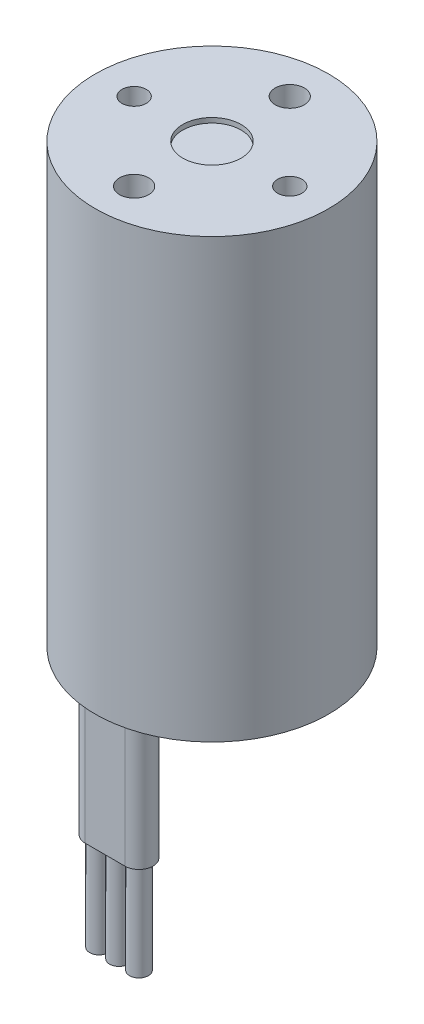
ISO-10303-21;
HEADER;
FILE_DESCRIPTION(('STEP AP214'),'2;1');
FILE_NAME('part.step','',(''),(''),'','','');
FILE_SCHEMA(('AUTOMOTIVE_DESIGN { 1 0 10303 214 1 1 1 1 }'));
ENDSEC;
DATA;
#1=APPLICATION_CONTEXT('core data for automotive mechanical design processes');
#2=APPLICATION_PROTOCOL_DEFINITION('international standard','automotive_design',2000,#1);
#3=PRODUCT_CONTEXT('',#1,'mechanical');
#4=PRODUCT('Part','Part','',(#3));
#5=PRODUCT_RELATED_PRODUCT_CATEGORY('part','',(#4));
#6=PRODUCT_DEFINITION_FORMATION('','',#4);
#7=PRODUCT_DEFINITION_CONTEXT('part definition',#1,'design');
#8=PRODUCT_DEFINITION('design','',#6,#7);
#9=PRODUCT_DEFINITION_SHAPE('','',#8);
#10=(LENGTH_UNIT() NAMED_UNIT(*) SI_UNIT(.MILLI.,.METRE.));
#11=(NAMED_UNIT(*) PLANE_ANGLE_UNIT() SI_UNIT($,.RADIAN.));
#12=(NAMED_UNIT(*) SI_UNIT($,.STERADIAN.) SOLID_ANGLE_UNIT());
#13=UNCERTAINTY_MEASURE_WITH_UNIT(LENGTH_MEASURE(1.E-05),#10,'distance_accuracy_value','');
#14=(GEOMETRIC_REPRESENTATION_CONTEXT(3) GLOBAL_UNCERTAINTY_ASSIGNED_CONTEXT((#13)) GLOBAL_UNIT_ASSIGNED_CONTEXT((#10,
#11,#12)) REPRESENTATION_CONTEXT('',''));
#15=CARTESIAN_POINT('',(0.,0.,0.));
#16=DIRECTION('',(0.,0.,1.));
#17=DIRECTION('',(1.,0.,0.));
#18=AXIS2_PLACEMENT_3D('',#15,#16,#17);
#19=CARTESIAN_POINT('',(-2.05357993225099,-13.,9.55357993225099));
#20=DIRECTION('',(0.,-1.,0.));
#21=DIRECTION('',(0.,0.,-1.));
#22=AXIS2_PLACEMENT_3D('',#19,#20,#21);
#23=PLANE('',#22);
#24=CARTESIAN_POINT('',(0.,-13.,9.55357993225099));
#25=DIRECTION('',(0.,-1.,0.));
#26=DIRECTION('',(0.,0.,-1.));
#27=AXIS2_PLACEMENT_3D('',#24,#25,#26);
#28=CIRCLE('',#27,0.966568061867365);
#29=CARTESIAN_POINT('',(0.,-13.,8.58701187038363));
#30=VERTEX_POINT('',#29);
#31=EDGE_CURVE('E167',#30,#30,#28,.T.);
#32=ORIENTED_EDGE('',*,*,#31,.F.);
#33=EDGE_LOOP('',(#32));
#34=FACE_BOUND('',#33,.T.);
#35=CARTESIAN_POINT('',(-2.05357993225099,-13.,9.55357993225099));
#36=DIRECTION('',(0.,-1.,0.));
#37=DIRECTION('',(0.,0.,-1.));
#38=AXIS2_PLACEMENT_3D('',#35,#36,#37);
#39=CIRCLE('',#38,1.44642006774901);
#40=CARTESIAN_POINT('',(-2.05357993225099,-13.,11.));
#41=VERTEX_POINT('',#40);
#42=CARTESIAN_POINT('',(-2.05357993225099,-13.,8.10715986450198));
#43=VERTEX_POINT('',#42);
#44=EDGE_CURVE('E96',#41,#43,#39,.T.);
#45=ORIENTED_EDGE('',*,*,#44,.T.);
#46=DIRECTION('',(1.,0.,0.));
#47=VECTOR('',#46,1.);
#48=CARTESIAN_POINT('',(-2.05357993225099,-13.,8.10715986450198));
#49=LINE('',#48,#47);
#50=CARTESIAN_POINT('',(2.05357993225099,-13.,8.10715986450198));
#51=VERTEX_POINT('',#50);
#52=EDGE_CURVE('E85',#43,#51,#49,.T.);
#53=ORIENTED_EDGE('',*,*,#52,.T.);
#54=CARTESIAN_POINT('',(2.05357993225099,-13.,9.55357993225099));
#55=DIRECTION('',(0.,-1.,0.));
#56=DIRECTION('',(0.,0.,-1.));
#57=AXIS2_PLACEMENT_3D('',#54,#55,#56);
#58=CIRCLE('',#57,1.44642006774901);
#59=CARTESIAN_POINT('',(2.05357993225099,-13.,11.));
#60=VERTEX_POINT('',#59);
#61=EDGE_CURVE('E95',#51,#60,#58,.T.);
#62=ORIENTED_EDGE('',*,*,#61,.T.);
#63=DIRECTION('',(-1.,0.,0.));
#64=VECTOR('',#63,1.);
#65=CARTESIAN_POINT('',(-2.05357993225099,-13.,11.));
#66=LINE('',#65,#64);
#67=EDGE_CURVE('E101',#60,#41,#66,.T.);
#68=ORIENTED_EDGE('',*,*,#67,.T.);
#69=EDGE_LOOP('',(#45,#53,#62,#68));
#70=FACE_BOUND('',#69,.T.);
#71=CARTESIAN_POINT('',(-2.05357993225099,-13.,9.55357993225099));
#72=DIRECTION('',(0.,-1.,0.));
#73=DIRECTION('',(0.,0.,-1.));
#74=AXIS2_PLACEMENT_3D('',#71,#72,#73);
#75=CIRCLE('',#74,0.966568061867365);
#76=CARTESIAN_POINT('',(-2.05357993225099,-13.,8.58701187038363));
#77=VERTEX_POINT('',#76);
#78=EDGE_CURVE('E161',#77,#77,#75,.T.);
#79=ORIENTED_EDGE('',*,*,#78,.F.);
#80=EDGE_LOOP('',(#79));
#81=FACE_BOUND('',#80,.T.);
#82=CARTESIAN_POINT('',(2.05357993225099,-13.,9.55357993225099));
#83=DIRECTION('',(0.,-1.,0.));
#84=DIRECTION('',(0.,0.,-1.));
#85=AXIS2_PLACEMENT_3D('',#82,#83,#84);
#86=CIRCLE('',#85,0.966568061867365);
#87=CARTESIAN_POINT('',(2.05357993225099,-13.,8.58701187038363));
#88=VERTEX_POINT('',#87);
#89=EDGE_CURVE('E173',#88,#88,#86,.T.);
#90=ORIENTED_EDGE('',*,*,#89,.F.);
#91=EDGE_LOOP('',(#90));
#92=FACE_BOUND('',#91,.T.);
#93=ADVANCED_FACE('F35',(#34,#70,#81,#92),#23,.T.);
#94=CARTESIAN_POINT('',(0.,0.,0.));
#95=DIRECTION('',(0.,1.,0.));
#96=DIRECTION('',(0.,0.,1.));
#97=AXIS2_PLACEMENT_3D('',#94,#95,#96);
#98=PLANE('',#97);
#99=CARTESIAN_POINT('',(0.,0.,0.));
#100=DIRECTION('',(0.,-1.,0.));
#101=DIRECTION('',(0.,0.,-1.));
#102=AXIS2_PLACEMENT_3D('',#99,#100,#101);
#103=CIRCLE('',#102,3.);
#104=CARTESIAN_POINT('',(0.,0.,-3.));
#105=VERTEX_POINT('',#104);
#106=EDGE_CURVE('E179',#105,#105,#103,.T.);
#107=ORIENTED_EDGE('',*,*,#106,.F.);
#108=EDGE_LOOP('',(#107));
#109=FACE_BOUND('',#108,.T.);
#110=CARTESIAN_POINT('',(0.,0.,0.));
#111=DIRECTION('',(0.,1.,0.));
#112=DIRECTION('',(0.,0.,1.));
#113=AXIS2_PLACEMENT_3D('',#110,#111,#112);
#114=CIRCLE('',#113,12.);
#115=CARTESIAN_POINT('',(0.,0.,-12.));
#116=VERTEX_POINT('',#115);
#117=EDGE_CURVE('E39',#116,#116,#114,.T.);
#118=ORIENTED_EDGE('',*,*,#117,.F.);
#119=EDGE_LOOP('',(#118));
#120=FACE_BOUND('',#119,.T.);
#121=CARTESIAN_POINT('',(-2.05357993225099,0.,9.55357993225099));
#122=DIRECTION('',(0.,-1.,0.));
#123=DIRECTION('',(0.,0.,-1.));
#124=AXIS2_PLACEMENT_3D('',#121,#122,#123);
#125=CIRCLE('',#124,1.44642006774901);
#126=CARTESIAN_POINT('',(-2.05357993225099,0.,11.));
#127=VERTEX_POINT('',#126);
#128=CARTESIAN_POINT('',(-2.05357993225099,0.,8.10715986450198));
#129=VERTEX_POINT('',#128);
#130=EDGE_CURVE('E108',#127,#129,#125,.T.);
#131=ORIENTED_EDGE('',*,*,#130,.F.);
#132=DIRECTION('',(-1.,0.,0.));
#133=VECTOR('',#132,1.);
#134=CARTESIAN_POINT('',(-2.05357993225099,0.,11.));
#135=LINE('',#134,#133);
#136=CARTESIAN_POINT('',(2.05357993225099,0.,11.));
#137=VERTEX_POINT('',#136);
#138=EDGE_CURVE('E105',#137,#127,#135,.T.);
#139=ORIENTED_EDGE('',*,*,#138,.F.);
#140=CARTESIAN_POINT('',(2.05357993225099,0.,9.55357993225099));
#141=DIRECTION('',(0.,-1.,0.));
#142=DIRECTION('',(0.,0.,-1.));
#143=AXIS2_PLACEMENT_3D('',#140,#141,#142);
#144=CIRCLE('',#143,1.44642006774901);
#145=CARTESIAN_POINT('',(2.05357993225099,0.,8.10715986450198));
#146=VERTEX_POINT('',#145);
#147=EDGE_CURVE('E55',#146,#137,#144,.T.);
#148=ORIENTED_EDGE('',*,*,#147,.F.);
#149=DIRECTION('',(1.,0.,0.));
#150=VECTOR('',#149,1.);
#151=CARTESIAN_POINT('',(-2.05357993225099,0.,8.10715986450198));
#152=LINE('',#151,#150);
#153=EDGE_CURVE('E50',#129,#146,#152,.T.);
#154=ORIENTED_EDGE('',*,*,#153,.F.);
#155=EDGE_LOOP('',(#131,#139,#148,#154));
#156=FACE_BOUND('',#155,.T.);
#157=ADVANCED_FACE('F143',(#109,#120,#156),#98,.F.);
#158=CARTESIAN_POINT('',(0.,45.,0.));
#159=DIRECTION('',(0.,-1.,0.));
#160=DIRECTION('',(0.,0.,-1.));
#161=AXIS2_PLACEMENT_3D('',#158,#159,#160);
#162=CYLINDRICAL_SURFACE('',#161,12.);
#163=CARTESIAN_POINT('',(0.,45.,0.));
#164=DIRECTION('',(0.,1.,0.));
#165=DIRECTION('',(0.,0.,1.));
#166=AXIS2_PLACEMENT_3D('',#163,#164,#165);
#167=CIRCLE('',#166,12.);
#168=CARTESIAN_POINT('',(0.,45.,-12.));
#169=VERTEX_POINT('',#168);
#170=EDGE_CURVE('E11',#169,#169,#167,.T.);
#171=CARTESIAN_POINT('',(0.,45.,-12.));
#172=CARTESIAN_POINT('',(0.,44.53125,-12.));
#173=CARTESIAN_POINT('',(0.,44.0625,-12.));
#174=CARTESIAN_POINT('',(0.,43.125,-12.));
#175=CARTESIAN_POINT('',(0.,42.65625,-12.));
#176=CARTESIAN_POINT('',(0.,41.71875,-12.));
#177=CARTESIAN_POINT('',(0.,41.25,-12.));
#178=CARTESIAN_POINT('',(0.,40.3125,-12.));
#179=CARTESIAN_POINT('',(0.,39.84375,-12.));
#180=CARTESIAN_POINT('',(0.,38.90625,-12.));
#181=CARTESIAN_POINT('',(0.,38.4375,-12.));
#182=CARTESIAN_POINT('',(0.,37.5,-12.));
#183=CARTESIAN_POINT('',(0.,37.03125,-12.));
#184=CARTESIAN_POINT('',(0.,36.09375,-12.));
#185=CARTESIAN_POINT('',(0.,35.625,-12.));
#186=CARTESIAN_POINT('',(0.,34.6875,-12.));
#187=CARTESIAN_POINT('',(0.,34.21875,-12.));
#188=CARTESIAN_POINT('',(0.,33.28125,-12.));
#189=CARTESIAN_POINT('',(0.,32.8125,-12.));
#190=CARTESIAN_POINT('',(0.,31.875,-12.));
#191=CARTESIAN_POINT('',(0.,31.40625,-12.));
#192=CARTESIAN_POINT('',(0.,30.46875,-12.));
#193=CARTESIAN_POINT('',(0.,30.,-12.));
#194=CARTESIAN_POINT('',(0.,29.0625,-12.));
#195=CARTESIAN_POINT('',(0.,28.59375,-12.));
#196=CARTESIAN_POINT('',(0.,27.65625,-12.));
#197=CARTESIAN_POINT('',(0.,27.1875,-12.));
#198=CARTESIAN_POINT('',(0.,26.25,-12.));
#199=CARTESIAN_POINT('',(0.,25.78125,-12.));
#200=CARTESIAN_POINT('',(0.,24.84375,-12.));
#201=CARTESIAN_POINT('',(0.,24.375,-12.));
#202=CARTESIAN_POINT('',(0.,23.4375,-12.));
#203=CARTESIAN_POINT('',(0.,22.96875,-12.));
#204=CARTESIAN_POINT('',(0.,22.03125,-12.));
#205=CARTESIAN_POINT('',(0.,21.5625,-12.));
#206=CARTESIAN_POINT('',(0.,20.625,-12.));
#207=CARTESIAN_POINT('',(0.,20.15625,-12.));
#208=CARTESIAN_POINT('',(0.,19.21875,-12.));
#209=CARTESIAN_POINT('',(0.,18.75,-12.));
#210=CARTESIAN_POINT('',(0.,17.8125,-12.));
#211=CARTESIAN_POINT('',(0.,17.34375,-12.));
#212=CARTESIAN_POINT('',(0.,16.40625,-12.));
#213=CARTESIAN_POINT('',(0.,15.9375,-12.));
#214=CARTESIAN_POINT('',(0.,15.,-12.));
#215=CARTESIAN_POINT('',(0.,14.53125,-12.));
#216=CARTESIAN_POINT('',(0.,13.59375,-12.));
#217=CARTESIAN_POINT('',(0.,13.125,-12.));
#218=CARTESIAN_POINT('',(0.,12.1875,-12.));
#219=CARTESIAN_POINT('',(0.,11.71875,-12.));
#220=CARTESIAN_POINT('',(0.,10.78125,-12.));
#221=CARTESIAN_POINT('',(0.,10.3125,-12.));
#222=CARTESIAN_POINT('',(0.,9.37499999999999,-12.));
#223=CARTESIAN_POINT('',(0.,8.90624999999999,-12.));
#224=CARTESIAN_POINT('',(0.,7.96874999999999,-12.));
#225=CARTESIAN_POINT('',(0.,7.5,-12.));
#226=CARTESIAN_POINT('',(0.,6.56249999999999,-12.));
#227=CARTESIAN_POINT('',(0.,6.09374999999999,-12.));
#228=CARTESIAN_POINT('',(0.,5.15624999999999,-12.));
#229=CARTESIAN_POINT('',(0.,4.68749999999999,-12.));
#230=CARTESIAN_POINT('',(0.,3.74999999999999,-12.));
#231=CARTESIAN_POINT('',(0.,3.28124999999999,-12.));
#232=CARTESIAN_POINT('',(0.,2.34374999999999,-12.));
#233=CARTESIAN_POINT('',(0.,1.87499999999999,-12.));
#234=CARTESIAN_POINT('',(0.,0.937499999999992,-12.));
#235=CARTESIAN_POINT('',(0.,0.468749999999993,-12.));
#236=CARTESIAN_POINT('',(0.,0.,-12.));
#237=B_SPLINE_CURVE_WITH_KNOTS('',3,(#171,#172,#173,#174,#175,#176,#177,#178,#179,#180,#181,
#182,#183,#184,#185,#186,#187,#188,#189,#190,#191,#192,#193,#194,#195,#196,#197,#198,#199,#200,
#201,#202,#203,#204,#205,#206,#207,#208,#209,#210,#211,#212,#213,#214,#215,#216,#217,#218,#219,
#220,#221,#222,#223,#224,#225,#226,#227,#228,#229,#230,#231,#232,#233,#234,#235,#236),
.UNSPECIFIED.,.F.,.F.,(4,2,2,2,2,2,2,2,2,2,2,2,2,2,2,2,2,2,2,2,2,2,2,2,2,2,2,2,2,2,2,2,4),(0.,
1.40625,2.8125,4.21874999999999,5.625,7.03125,8.43749999999999,9.84375,11.25,12.65625,14.0625,
15.46875,16.875,18.28125,19.6875,21.09375,22.5,23.90625,25.3125,26.71875,28.125,29.53125,
30.9375,32.34375,33.75,35.15625,36.5625,37.96875,39.375,40.78125,42.1875,43.59375,45.),.UNSPECIFIED.);
#238=EDGE_CURVE('BSEAM37',#169,#116,#237,.T.);
#239=ORIENTED_EDGE('',*,*,#170,.F.);
#240=ORIENTED_EDGE('',*,*,#117,.T.);
#241=ORIENTED_EDGE('',*,*,#238,.T.);
#242=ORIENTED_EDGE('',*,*,#238,.F.);
#243=EDGE_LOOP('',(#239,#241,#240,#242));
#244=FACE_BOUND('',#243,.T.);
#245=ADVANCED_FACE('F37',(#244),#162,.T.);
#246=CARTESIAN_POINT('',(0.,45.,0.));
#247=DIRECTION('',(0.,1.,0.));
#248=DIRECTION('',(0.,0.,1.));
#249=AXIS2_PLACEMENT_3D('',#246,#247,#248);
#250=PLANE('',#249);
#251=CARTESIAN_POINT('',(0.,45.,0.));
#252=DIRECTION('',(0.,1.,0.));
#253=DIRECTION('',(0.,0.,1.));
#254=AXIS2_PLACEMENT_3D('',#251,#252,#253);
#255=CIRCLE('',#254,3.);
#256=CARTESIAN_POINT('',(0.,45.,3.));
#257=VERTEX_POINT('',#256);
#258=EDGE_CURVE('E185',#257,#257,#255,.T.);
#259=ORIENTED_EDGE('',*,*,#258,.F.);
#260=EDGE_LOOP('',(#259));
#261=FACE_BOUND('',#260,.T.);
#262=CARTESIAN_POINT('',(0.,45.,-8.));
#263=DIRECTION('',(0.,1.,0.));
#264=DIRECTION('',(0.,0.,1.));
#265=AXIS2_PLACEMENT_3D('',#262,#263,#264);
#266=CIRCLE('',#265,1.5);
#267=CARTESIAN_POINT('',(0.,45.,-6.5));
#268=VERTEX_POINT('',#267);
#269=EDGE_CURVE('E109',#268,#268,#266,.T.);
#270=ORIENTED_EDGE('',*,*,#269,.F.);
#271=EDGE_LOOP('',(#270));
#272=FACE_BOUND('',#271,.T.);
#273=CARTESIAN_POINT('',(0.,45.,8.));
#274=DIRECTION('',(0.,1.,0.));
#275=DIRECTION('',(0.,0.,1.));
#276=AXIS2_PLACEMENT_3D('',#273,#274,#275);
#277=CIRCLE('',#276,1.5);
#278=CARTESIAN_POINT('',(0.,45.,9.5));
#279=VERTEX_POINT('',#278);
#280=EDGE_CURVE('E120',#279,#279,#277,.T.);
#281=ORIENTED_EDGE('',*,*,#280,.F.);
#282=EDGE_LOOP('',(#281));
#283=FACE_BOUND('',#282,.T.);
#284=CARTESIAN_POINT('',(8.,45.,0.));
#285=DIRECTION('',(0.,1.,0.));
#286=DIRECTION('',(0.,0.,1.));
#287=AXIS2_PLACEMENT_3D('',#284,#285,#286);
#288=CIRCLE('',#287,1.24999999999999);
#289=CARTESIAN_POINT('',(8.,45.,1.25000000000004));
#290=VERTEX_POINT('',#289);
#291=EDGE_CURVE('E126',#290,#290,#288,.T.);
#292=ORIENTED_EDGE('',*,*,#291,.F.);
#293=EDGE_LOOP('',(#292));
#294=FACE_BOUND('',#293,.T.);
#295=CARTESIAN_POINT('',(-8.,45.,0.));
#296=DIRECTION('',(0.,1.,0.));
#297=DIRECTION('',(0.,0.,1.));
#298=AXIS2_PLACEMENT_3D('',#295,#296,#297);
#299=CIRCLE('',#298,1.24999999999999);
#300=CARTESIAN_POINT('',(-8.,45.,1.24999999999999));
#301=VERTEX_POINT('',#300);
#302=EDGE_CURVE('E132',#301,#301,#299,.T.);
#303=ORIENTED_EDGE('',*,*,#302,.F.);
#304=EDGE_LOOP('',(#303));
#305=FACE_BOUND('',#304,.T.);
#306=ORIENTED_EDGE('',*,*,#170,.T.);
#307=EDGE_LOOP('',(#306));
#308=FACE_BOUND('',#307,.T.);
#309=ADVANCED_FACE('F200',(#261,#272,#283,#294,#305,#308),#250,.T.);
#310=CARTESIAN_POINT('',(-8.,41.,0.));
#311=DIRECTION('',(0.,1.,0.));
#312=DIRECTION('',(0.,0.,1.));
#313=AXIS2_PLACEMENT_3D('',#310,#311,#312);
#314=CONICAL_SURFACE('',#313,1.25,1.02974425867666);
#315=CARTESIAN_POINT('',(-8.,40.2489242262155,0.));
#316=VERTEX_POINT('',#315);
#317=VERTEX_LOOP('',#316);
#318=FACE_BOUND('',#317,.T.);
#319=CARTESIAN_POINT('',(-8.,41.,0.));
#320=DIRECTION('',(0.,1.,0.));
#321=DIRECTION('',(0.,0.,1.));
#322=AXIS2_PLACEMENT_3D('',#319,#320,#321);
#323=CIRCLE('',#322,1.25);
#324=CARTESIAN_POINT('',(-8.,41.,1.25));
#325=VERTEX_POINT('',#324);
#326=EDGE_CURVE('E135',#325,#325,#323,.T.);
#327=ORIENTED_EDGE('',*,*,#326,.T.);
#328=EDGE_LOOP('',(#327));
#329=FACE_BOUND('',#328,.T.);
#330=ADVANCED_FACE('F203',(#318,#329),#314,.F.);
#331=CARTESIAN_POINT('',(-8.,45.,0.));
#332=DIRECTION('',(0.,1.,0.));
#333=DIRECTION('',(0.,0.,1.));
#334=AXIS2_PLACEMENT_3D('',#331,#332,#333);
#335=CYLINDRICAL_SURFACE('',#334,1.24999999999999);
#336=ORIENTED_EDGE('',*,*,#326,.F.);
#337=EDGE_LOOP('',(#336));
#338=FACE_BOUND('',#337,.T.);
#339=ORIENTED_EDGE('',*,*,#302,.T.);
#340=EDGE_LOOP('',(#339));
#341=FACE_BOUND('',#340,.T.);
#342=ADVANCED_FACE('F261',(#338,#341),#335,.F.);
#343=CARTESIAN_POINT('',(8.,41.,0.));
#344=DIRECTION('',(0.,1.,0.));
#345=DIRECTION('',(0.,0.,1.));
#346=AXIS2_PLACEMENT_3D('',#343,#344,#345);
#347=CONICAL_SURFACE('',#346,1.25,1.02974425867666);
#348=CARTESIAN_POINT('',(8.,40.2489242262155,0.));
#349=VERTEX_POINT('',#348);
#350=VERTEX_LOOP('',#349);
#351=FACE_BOUND('',#350,.T.);
#352=CARTESIAN_POINT('',(8.,41.,0.));
#353=DIRECTION('',(0.,1.,0.));
#354=DIRECTION('',(0.,0.,1.));
#355=AXIS2_PLACEMENT_3D('',#352,#353,#354);
#356=CIRCLE('',#355,1.25);
#357=CARTESIAN_POINT('',(8.,41.,1.25000000000005));
#358=VERTEX_POINT('',#357);
#359=EDGE_CURVE('E129',#358,#358,#356,.T.);
#360=ORIENTED_EDGE('',*,*,#359,.T.);
#361=EDGE_LOOP('',(#360));
#362=FACE_BOUND('',#361,.T.);
#363=ADVANCED_FACE('F257',(#351,#362),#347,.F.);
#364=CARTESIAN_POINT('',(8.,45.,0.));
#365=DIRECTION('',(0.,1.,0.));
#366=DIRECTION('',(0.,0.,1.));
#367=AXIS2_PLACEMENT_3D('',#364,#365,#366);
#368=CYLINDRICAL_SURFACE('',#367,1.24999999999999);
#369=ORIENTED_EDGE('',*,*,#359,.F.);
#370=EDGE_LOOP('',(#369));
#371=FACE_BOUND('',#370,.T.);
#372=ORIENTED_EDGE('',*,*,#291,.T.);
#373=EDGE_LOOP('',(#372));
#374=FACE_BOUND('',#373,.T.);
#375=ADVANCED_FACE('F253',(#371,#374),#368,.F.);
#376=CARTESIAN_POINT('',(0.,41.,8.));
#377=DIRECTION('',(0.,1.,0.));
#378=DIRECTION('',(0.,0.,1.));
#379=AXIS2_PLACEMENT_3D('',#376,#377,#378);
#380=CONICAL_SURFACE('',#379,1.5,1.02974425867665);
#381=CARTESIAN_POINT('',(0.,40.0987090714587,8.));
#382=VERTEX_POINT('',#381);
#383=VERTEX_LOOP('',#382);
#384=FACE_BOUND('',#383,.T.);
#385=CARTESIAN_POINT('',(0.,41.,8.));
#386=DIRECTION('',(0.,1.,0.));
#387=DIRECTION('',(0.,0.,1.));
#388=AXIS2_PLACEMENT_3D('',#385,#386,#387);
#389=CIRCLE('',#388,1.5);
#390=CARTESIAN_POINT('',(0.,41.,9.5));
#391=VERTEX_POINT('',#390);
#392=EDGE_CURVE('E123',#391,#391,#389,.T.);
#393=ORIENTED_EDGE('',*,*,#392,.T.);
#394=EDGE_LOOP('',(#393));
#395=FACE_BOUND('',#394,.T.);
#396=ADVANCED_FACE('F249',(#384,#395),#380,.F.);
#397=CARTESIAN_POINT('',(0.,45.,8.));
#398=DIRECTION('',(0.,1.,0.));
#399=DIRECTION('',(0.,0.,1.));
#400=AXIS2_PLACEMENT_3D('',#397,#398,#399);
#401=CYLINDRICAL_SURFACE('',#400,1.5);
#402=ORIENTED_EDGE('',*,*,#392,.F.);
#403=EDGE_LOOP('',(#402));
#404=FACE_BOUND('',#403,.T.);
#405=ORIENTED_EDGE('',*,*,#280,.T.);
#406=EDGE_LOOP('',(#405));
#407=FACE_BOUND('',#406,.T.);
#408=ADVANCED_FACE('F245',(#404,#407),#401,.F.);
#409=CARTESIAN_POINT('',(0.,41.,-8.));
#410=DIRECTION('',(0.,1.,0.));
#411=DIRECTION('',(0.,0.,1.));
#412=AXIS2_PLACEMENT_3D('',#409,#410,#411);
#413=CONICAL_SURFACE('',#412,1.5,1.02974425867665);
#414=CARTESIAN_POINT('',(0.,40.0987090714587,-8.));
#415=VERTEX_POINT('',#414);
#416=VERTEX_LOOP('',#415);
#417=FACE_BOUND('',#416,.T.);
#418=CARTESIAN_POINT('',(0.,41.,-8.));
#419=DIRECTION('',(0.,1.,0.));
#420=DIRECTION('',(0.,0.,1.));
#421=AXIS2_PLACEMENT_3D('',#418,#419,#420);
#422=CIRCLE('',#421,1.5);
#423=CARTESIAN_POINT('',(0.,41.,-6.5));
#424=VERTEX_POINT('',#423);
#425=EDGE_CURVE('E112',#424,#424,#422,.T.);
#426=ORIENTED_EDGE('',*,*,#425,.T.);
#427=EDGE_LOOP('',(#426));
#428=FACE_BOUND('',#427,.T.);
#429=ADVANCED_FACE('F241',(#417,#428),#413,.F.);
#430=CARTESIAN_POINT('',(0.,45.,-8.));
#431=DIRECTION('',(0.,1.,0.));
#432=DIRECTION('',(0.,0.,1.));
#433=AXIS2_PLACEMENT_3D('',#430,#431,#432);
#434=CYLINDRICAL_SURFACE('',#433,1.5);
#435=ORIENTED_EDGE('',*,*,#425,.F.);
#436=EDGE_LOOP('',(#435));
#437=FACE_BOUND('',#436,.T.);
#438=ORIENTED_EDGE('',*,*,#269,.T.);
#439=EDGE_LOOP('',(#438));
#440=FACE_BOUND('',#439,.T.);
#441=ADVANCED_FACE('F238',(#437,#440),#434,.F.);
#442=CARTESIAN_POINT('',(-2.05357993225099,-13.,9.55357993225099));
#443=DIRECTION('',(0.,1.,0.));
#444=DIRECTION('',(0.,0.,1.));
#445=AXIS2_PLACEMENT_3D('',#442,#443,#444);
#446=CYLINDRICAL_SURFACE('',#445,1.44642006774901);
#447=ORIENTED_EDGE('',*,*,#130,.T.);
#448=DIRECTION('',(0.,1.,0.));
#449=VECTOR('',#448,1.);
#450=CARTESIAN_POINT('',(-2.05357993225099,-13.,8.10715986450198));
#451=LINE('',#450,#449);
#452=EDGE_CURVE('E89',#43,#129,#451,.T.);
#453=ORIENTED_EDGE('',*,*,#452,.F.);
#454=ORIENTED_EDGE('',*,*,#44,.F.);
#455=DIRECTION('',(0.,1.,0.));
#456=VECTOR('',#455,1.);
#457=CARTESIAN_POINT('',(-2.05357993225099,-13.,11.));
#458=LINE('',#457,#456);
#459=EDGE_CURVE('E152',#41,#127,#458,.T.);
#460=ORIENTED_EDGE('',*,*,#459,.T.);
#461=EDGE_LOOP('',(#447,#453,#454,#460));
#462=FACE_BOUND('',#461,.T.);
#463=ADVANCED_FACE('F107',(#462),#446,.T.);
#464=CARTESIAN_POINT('',(-2.05357993225099,-13.,8.10715986450198));
#465=DIRECTION('',(0.,0.,1.));
#466=DIRECTION('',(1.,0.,0.));
#467=AXIS2_PLACEMENT_3D('',#464,#465,#466);
#468=PLANE('',#467);
#469=ORIENTED_EDGE('',*,*,#153,.T.);
#470=DIRECTION('',(0.,1.,0.));
#471=VECTOR('',#470,1.);
#472=CARTESIAN_POINT('',(2.05357993225099,-13.,8.10715986450198));
#473=LINE('',#472,#471);
#474=EDGE_CURVE('E92',#51,#146,#473,.T.);
#475=ORIENTED_EDGE('',*,*,#474,.F.);
#476=ORIENTED_EDGE('',*,*,#52,.F.);
#477=ORIENTED_EDGE('',*,*,#452,.T.);
#478=EDGE_LOOP('',(#469,#475,#476,#477));
#479=FACE_BOUND('',#478,.T.);
#480=ADVANCED_FACE('F87',(#479),#468,.F.);
#481=CARTESIAN_POINT('',(2.05357993225099,-13.,9.55357993225099));
#482=DIRECTION('',(0.,1.,0.));
#483=DIRECTION('',(0.,0.,1.));
#484=AXIS2_PLACEMENT_3D('',#481,#482,#483);
#485=CYLINDRICAL_SURFACE('',#484,1.44642006774901);
#486=ORIENTED_EDGE('',*,*,#147,.T.);
#487=DIRECTION('',(0.,1.,0.));
#488=VECTOR('',#487,1.);
#489=CARTESIAN_POINT('',(2.05357993225099,-13.,11.));
#490=LINE('',#489,#488);
#491=EDGE_CURVE('E114',#60,#137,#490,.T.);
#492=ORIENTED_EDGE('',*,*,#491,.F.);
#493=ORIENTED_EDGE('',*,*,#61,.F.);
#494=ORIENTED_EDGE('',*,*,#474,.T.);
#495=EDGE_LOOP('',(#486,#492,#493,#494));
#496=FACE_BOUND('',#495,.T.);
#497=ADVANCED_FACE('F230',(#496),#485,.T.);
#498=CARTESIAN_POINT('',(-2.05357993225099,-13.,11.));
#499=DIRECTION('',(0.,0.,-1.));
#500=DIRECTION('',(-1.,0.,0.));
#501=AXIS2_PLACEMENT_3D('',#498,#499,#500);
#502=PLANE('',#501);
#503=ORIENTED_EDGE('',*,*,#138,.T.);
#504=ORIENTED_EDGE('',*,*,#459,.F.);
#505=ORIENTED_EDGE('',*,*,#67,.F.);
#506=ORIENTED_EDGE('',*,*,#491,.T.);
#507=EDGE_LOOP('',(#503,#504,#505,#506));
#508=FACE_BOUND('',#507,.T.);
#509=ADVANCED_FACE('F151',(#508),#502,.F.);
#510=CARTESIAN_POINT('',(-2.05357993225099,-23.,9.55357993225099));
#511=DIRECTION('',(0.,1.,0.));
#512=DIRECTION('',(0.,0.,1.));
#513=AXIS2_PLACEMENT_3D('',#510,#511,#512);
#514=CYLINDRICAL_SURFACE('',#513,0.966568061867365);
#515=CARTESIAN_POINT('',(-2.05357993225099,-23.,9.55357993225099));
#516=DIRECTION('',(0.,-1.,0.));
#517=DIRECTION('',(0.,0.,-1.));
#518=AXIS2_PLACEMENT_3D('',#515,#516,#517);
#519=CIRCLE('',#518,0.966568061867365);
#520=CARTESIAN_POINT('',(-2.05357993225099,-23.,8.58701187038363));
#521=VERTEX_POINT('',#520);
#522=EDGE_CURVE('E147',#521,#521,#519,.T.);
#523=ORIENTED_EDGE('',*,*,#522,.F.);
#524=EDGE_LOOP('',(#523));
#525=FACE_BOUND('',#524,.T.);
#526=ORIENTED_EDGE('',*,*,#78,.T.);
#527=EDGE_LOOP('',(#526));
#528=FACE_BOUND('',#527,.T.);
#529=ADVANCED_FACE('F226',(#525,#528),#514,.T.);
#530=CARTESIAN_POINT('',(-2.05357993225099,-23.,9.55357993225099));
#531=DIRECTION('',(0.,-1.,0.));
#532=DIRECTION('',(0.,0.,-1.));
#533=AXIS2_PLACEMENT_3D('',#530,#531,#532);
#534=PLANE('',#533);
#535=ORIENTED_EDGE('',*,*,#522,.T.);
#536=EDGE_LOOP('',(#535));
#537=FACE_BOUND('',#536,.T.);
#538=ADVANCED_FACE('F322',(#537),#534,.T.);
#539=CARTESIAN_POINT('',(0.,-23.,9.55357993225099));
#540=DIRECTION('',(0.,1.,0.));
#541=DIRECTION('',(0.,0.,1.));
#542=AXIS2_PLACEMENT_3D('',#539,#540,#541);
#543=CYLINDRICAL_SURFACE('',#542,0.966568061867365);
#544=CARTESIAN_POINT('',(0.,-23.,9.55357993225099));
#545=DIRECTION('',(0.,-1.,0.));
#546=DIRECTION('',(0.,0.,-1.));
#547=AXIS2_PLACEMENT_3D('',#544,#545,#546);
#548=CIRCLE('',#547,0.966568061867365);
#549=CARTESIAN_POINT('',(0.,-23.,8.58701187038363));
#550=VERTEX_POINT('',#549);
#551=EDGE_CURVE('E164',#550,#550,#548,.T.);
#552=ORIENTED_EDGE('',*,*,#551,.F.);
#553=EDGE_LOOP('',(#552));
#554=FACE_BOUND('',#553,.T.);
#555=ORIENTED_EDGE('',*,*,#31,.T.);
#556=EDGE_LOOP('',(#555));
#557=FACE_BOUND('',#556,.T.);
#558=ADVANCED_FACE('F330',(#554,#557),#543,.T.);
#559=CARTESIAN_POINT('',(0.,-23.,9.55357993225099));
#560=DIRECTION('',(0.,-1.,0.));
#561=DIRECTION('',(0.,0.,-1.));
#562=AXIS2_PLACEMENT_3D('',#559,#560,#561);
#563=PLANE('',#562);
#564=ORIENTED_EDGE('',*,*,#551,.T.);
#565=EDGE_LOOP('',(#564));
#566=FACE_BOUND('',#565,.T.);
#567=ADVANCED_FACE('F337',(#566),#563,.T.);
#568=CARTESIAN_POINT('',(2.05357993225099,-23.,9.55357993225099));
#569=DIRECTION('',(0.,1.,0.));
#570=DIRECTION('',(0.,0.,1.));
#571=AXIS2_PLACEMENT_3D('',#568,#569,#570);
#572=CYLINDRICAL_SURFACE('',#571,0.966568061867365);
#573=CARTESIAN_POINT('',(2.05357993225099,-23.,9.55357993225099));
#574=DIRECTION('',(0.,-1.,0.));
#575=DIRECTION('',(0.,0.,-1.));
#576=AXIS2_PLACEMENT_3D('',#573,#574,#575);
#577=CIRCLE('',#576,0.966568061867365);
#578=CARTESIAN_POINT('',(2.05357993225099,-23.,8.58701187038363));
#579=VERTEX_POINT('',#578);
#580=EDGE_CURVE('E170',#579,#579,#577,.T.);
#581=ORIENTED_EDGE('',*,*,#580,.F.);
#582=EDGE_LOOP('',(#581));
#583=FACE_BOUND('',#582,.T.);
#584=ORIENTED_EDGE('',*,*,#89,.T.);
#585=EDGE_LOOP('',(#584));
#586=FACE_BOUND('',#585,.T.);
#587=ADVANCED_FACE('F345',(#583,#586),#572,.T.);
#588=CARTESIAN_POINT('',(2.05357993225099,-23.,9.55357993225099));
#589=DIRECTION('',(0.,-1.,0.));
#590=DIRECTION('',(0.,0.,-1.));
#591=AXIS2_PLACEMENT_3D('',#588,#589,#590);
#592=PLANE('',#591);
#593=ORIENTED_EDGE('',*,*,#580,.T.);
#594=EDGE_LOOP('',(#593));
#595=FACE_BOUND('',#594,.T.);
#596=ADVANCED_FACE('F353',(#595),#592,.T.);
#597=CARTESIAN_POINT('',(0.,0.5,0.));
#598=DIRECTION('',(0.,-1.,0.));
#599=DIRECTION('',(0.,0.,-1.));
#600=AXIS2_PLACEMENT_3D('',#597,#598,#599);
#601=CYLINDRICAL_SURFACE('',#600,3.);
#602=CARTESIAN_POINT('',(0.,0.5,0.));
#603=DIRECTION('',(0.,-1.,0.));
#604=DIRECTION('',(0.,0.,-1.));
#605=AXIS2_PLACEMENT_3D('',#602,#603,#604);
#606=CIRCLE('',#605,3.);
#607=CARTESIAN_POINT('',(0.,0.5,-3.));
#608=VERTEX_POINT('',#607);
#609=EDGE_CURVE('E176',#608,#608,#606,.T.);
#610=ORIENTED_EDGE('',*,*,#609,.F.);
#611=EDGE_LOOP('',(#610));
#612=FACE_BOUND('',#611,.T.);
#613=ORIENTED_EDGE('',*,*,#106,.T.);
#614=EDGE_LOOP('',(#613));
#615=FACE_BOUND('',#614,.T.);
#616=ADVANCED_FACE('F361',(#612,#615),#601,.F.);
#617=CARTESIAN_POINT('',(0.,0.5,0.));
#618=DIRECTION('',(0.,-1.,0.));
#619=DIRECTION('',(0.,0.,-1.));
#620=AXIS2_PLACEMENT_3D('',#617,#618,#619);
#621=PLANE('',#620);
#622=ORIENTED_EDGE('',*,*,#609,.T.);
#623=EDGE_LOOP('',(#622));
#624=FACE_BOUND('',#623,.T.);
#625=ADVANCED_FACE('F196',(#624),#621,.T.);
#626=CARTESIAN_POINT('',(0.,44.5,0.));
#627=DIRECTION('',(0.,1.,0.));
#628=DIRECTION('',(0.,0.,1.));
#629=AXIS2_PLACEMENT_3D('',#626,#627,#628);
#630=CYLINDRICAL_SURFACE('',#629,3.);
#631=CARTESIAN_POINT('',(0.,44.5,0.));
#632=DIRECTION('',(0.,1.,0.));
#633=DIRECTION('',(0.,0.,1.));
#634=AXIS2_PLACEMENT_3D('',#631,#632,#633);
#635=CIRCLE('',#634,3.);
#636=CARTESIAN_POINT('',(0.,44.5,3.));
#637=VERTEX_POINT('',#636);
#638=EDGE_CURVE('E182',#637,#637,#635,.T.);
#639=ORIENTED_EDGE('',*,*,#638,.F.);
#640=EDGE_LOOP('',(#639));
#641=FACE_BOUND('',#640,.T.);
#642=ORIENTED_EDGE('',*,*,#258,.T.);
#643=EDGE_LOOP('',(#642));
#644=FACE_BOUND('',#643,.T.);
#645=ADVANCED_FACE('F193',(#641,#644),#630,.F.);
#646=CARTESIAN_POINT('',(0.,44.5,0.));
#647=DIRECTION('',(0.,1.,0.));
#648=DIRECTION('',(0.,0.,1.));
#649=AXIS2_PLACEMENT_3D('',#646,#647,#648);
#650=PLANE('',#649);
#651=ORIENTED_EDGE('',*,*,#638,.T.);
#652=EDGE_LOOP('',(#651));
#653=FACE_BOUND('',#652,.T.);
#654=ADVANCED_FACE('F191',(#653),#650,.T.);
#655=CLOSED_SHELL('',(#93,#157,#245,#309,#330,#342,#363,#375,#396,#408,#429,#441,#463,#480,#497,
#509,#529,#538,#558,#567,#587,#596,#616,#625,#645,#654));
#656=MANIFOLD_SOLID_BREP('B2',#655);
#657=ADVANCED_BREP_SHAPE_REPRESENTATION('',(#18,#656),#14);
#658=SHAPE_DEFINITION_REPRESENTATION(#9,#657);
ENDSEC;
END-ISO-10303-21;
